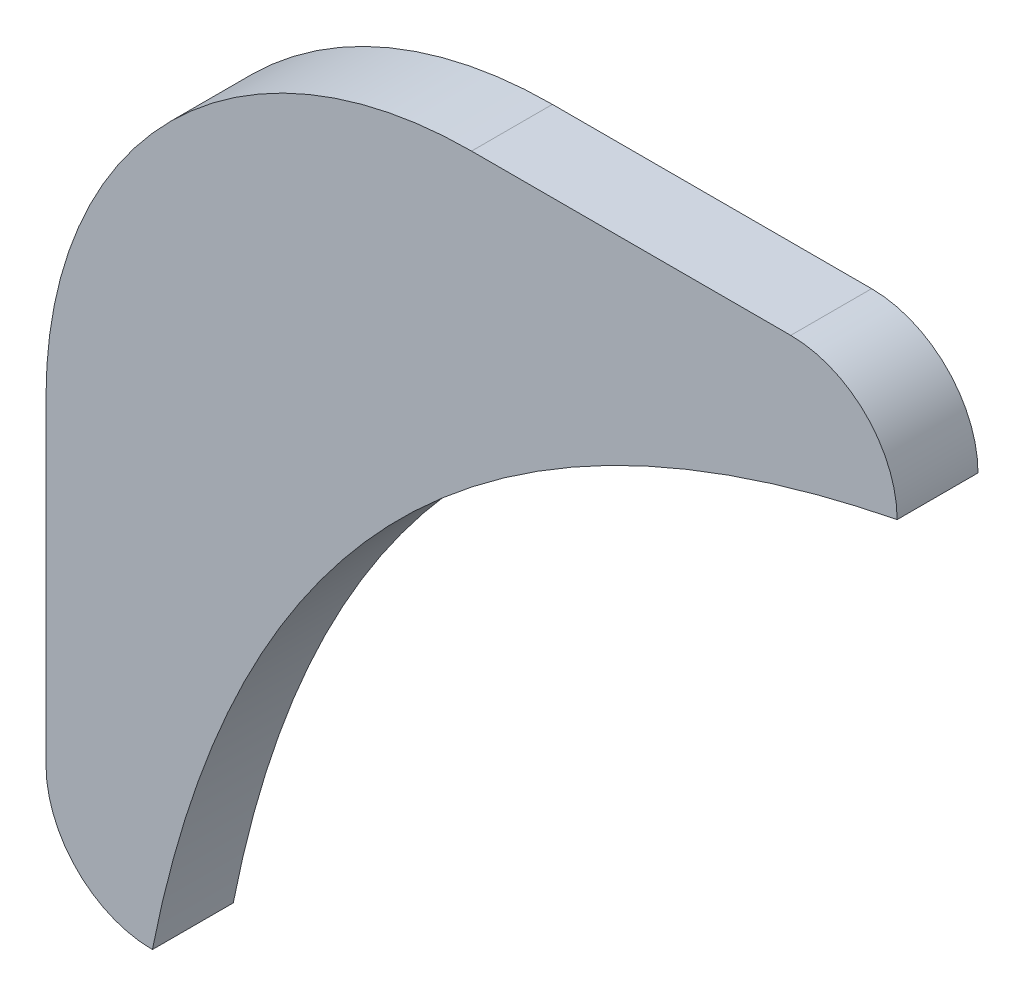
ISO-10303-21;
HEADER;
FILE_DESCRIPTION(('STEP AP214'),'2;1');
FILE_NAME('part.step','',(''),(''),'','','');
FILE_SCHEMA(('AUTOMOTIVE_DESIGN { 1 0 10303 214 1 1 1 1 }'));
ENDSEC;
DATA;
#1=APPLICATION_CONTEXT('core data for automotive mechanical design processes');
#2=APPLICATION_PROTOCOL_DEFINITION('international standard','automotive_design',2000,#1);
#3=PRODUCT_CONTEXT('',#1,'mechanical');
#4=PRODUCT('Part','Part','',(#3));
#5=PRODUCT_RELATED_PRODUCT_CATEGORY('part','',(#4));
#6=PRODUCT_DEFINITION_FORMATION('','',#4);
#7=PRODUCT_DEFINITION_CONTEXT('part definition',#1,'design');
#8=PRODUCT_DEFINITION('design','',#6,#7);
#9=PRODUCT_DEFINITION_SHAPE('','',#8);
#10=(LENGTH_UNIT() NAMED_UNIT(*) SI_UNIT(.MILLI.,.METRE.));
#11=(NAMED_UNIT(*) PLANE_ANGLE_UNIT() SI_UNIT($,.RADIAN.));
#12=(NAMED_UNIT(*) SI_UNIT($,.STERADIAN.) SOLID_ANGLE_UNIT());
#13=UNCERTAINTY_MEASURE_WITH_UNIT(LENGTH_MEASURE(1.E-05),#10,'distance_accuracy_value','');
#14=(GEOMETRIC_REPRESENTATION_CONTEXT(3) GLOBAL_UNCERTAINTY_ASSIGNED_CONTEXT((#13)) GLOBAL_UNIT_ASSIGNED_CONTEXT((#10,
#11,#12)) REPRESENTATION_CONTEXT('',''));
#15=CARTESIAN_POINT('',(0.,0.,0.));
#16=DIRECTION('',(0.,0.,1.));
#17=DIRECTION('',(1.,0.,0.));
#18=AXIS2_PLACEMENT_3D('',#15,#16,#17);
#19=CARTESIAN_POINT('',(44.45,44.45,4.826));
#20=DIRECTION('',(0.,0.,-1.));
#21=DIRECTION('',(-1.,0.,0.));
#22=AXIS2_PLACEMENT_3D('',#19,#20,#21);
#23=CYLINDRICAL_SURFACE('',#22,6.35);
#24=CARTESIAN_POINT('',(44.45,44.45,0.));
#25=DIRECTION('',(0.,0.,1.));
#26=DIRECTION('',(-1.,0.,0.));
#27=AXIS2_PLACEMENT_3D('',#24,#25,#26);
#28=CIRCLE('',#27,6.35);
#29=CARTESIAN_POINT('',(50.8,44.45,0.));
#30=VERTEX_POINT('',#29);
#31=CARTESIAN_POINT('',(44.4499999999999,50.8,0.));
#32=VERTEX_POINT('',#31);
#33=EDGE_CURVE('E120',#30,#32,#28,.T.);
#34=ORIENTED_EDGE('',*,*,#33,.T.);
#35=DIRECTION('',(0.,0.,-1.));
#36=VECTOR('',#35,1.);
#37=CARTESIAN_POINT('',(44.4499999999999,50.8,4.826));
#38=LINE('',#37,#36);
#39=CARTESIAN_POINT('',(44.4499999999999,50.8,4.826));
#40=VERTEX_POINT('',#39);
#41=EDGE_CURVE('E11',#40,#32,#38,.T.);
#42=ORIENTED_EDGE('',*,*,#41,.F.);
#43=CARTESIAN_POINT('',(44.45,44.45,4.826));
#44=DIRECTION('',(0.,0.,1.));
#45=DIRECTION('',(-1.,0.,0.));
#46=AXIS2_PLACEMENT_3D('',#43,#44,#45);
#47=CIRCLE('',#46,6.35);
#48=CARTESIAN_POINT('',(50.8,44.45,4.826));
#49=VERTEX_POINT('',#48);
#50=EDGE_CURVE('E160',#49,#40,#47,.T.);
#51=ORIENTED_EDGE('',*,*,#50,.F.);
#52=DIRECTION('',(0.,0.,-1.));
#53=VECTOR('',#52,1.);
#54=CARTESIAN_POINT('',(50.8,44.45,4.826));
#55=LINE('',#54,#53);
#56=EDGE_CURVE('E113',#49,#30,#55,.T.);
#57=ORIENTED_EDGE('',*,*,#56,.T.);
#58=EDGE_LOOP('',(#34,#42,#51,#57));
#59=FACE_BOUND('',#58,.T.);
#60=ADVANCED_FACE('F33',(#59),#23,.T.);
#61=CARTESIAN_POINT('',(25.4000000000002,50.8,4.826));
#62=DIRECTION('',(0.,-1.,0.));
#63=DIRECTION('',(0.,0.,-1.));
#64=AXIS2_PLACEMENT_3D('',#61,#62,#63);
#65=PLANE('',#64);
#66=DIRECTION('',(-1.,0.,0.));
#67=VECTOR('',#66,1.);
#68=CARTESIAN_POINT('',(25.4000000000002,50.8,0.));
#69=LINE('',#68,#67);
#70=CARTESIAN_POINT('',(25.4000000000002,50.8,0.));
#71=VERTEX_POINT('',#70);
#72=EDGE_CURVE('E145',#32,#71,#69,.T.);
#73=ORIENTED_EDGE('',*,*,#72,.T.);
#74=DIRECTION('',(0.,0.,-1.));
#75=VECTOR('',#74,1.);
#76=CARTESIAN_POINT('',(25.4000000000002,50.8,4.826));
#77=LINE('',#76,#75);
#78=CARTESIAN_POINT('',(25.4000000000002,50.8,4.826));
#79=VERTEX_POINT('',#78);
#80=EDGE_CURVE('E41',#79,#71,#77,.T.);
#81=ORIENTED_EDGE('',*,*,#80,.F.);
#82=DIRECTION('',(-1.,0.,0.));
#83=VECTOR('',#82,1.);
#84=CARTESIAN_POINT('',(25.4000000000002,50.8,4.826));
#85=LINE('',#84,#83);
#86=EDGE_CURVE('E86',#40,#79,#85,.T.);
#87=ORIENTED_EDGE('',*,*,#86,.F.);
#88=ORIENTED_EDGE('',*,*,#41,.T.);
#89=EDGE_LOOP('',(#73,#81,#87,#88));
#90=FACE_BOUND('',#89,.T.);
#91=ADVANCED_FACE('F138',(#90),#65,.F.);
#92=CARTESIAN_POINT('',(25.4,25.4,4.826));
#93=DIRECTION('',(0.,0.,-1.));
#94=DIRECTION('',(-1.,0.,0.));
#95=AXIS2_PLACEMENT_3D('',#92,#93,#94);
#96=CYLINDRICAL_SURFACE('',#95,25.4);
#97=CARTESIAN_POINT('',(25.4,25.4,0.));
#98=DIRECTION('',(0.,0.,1.));
#99=DIRECTION('',(-1.,0.,0.));
#100=AXIS2_PLACEMENT_3D('',#97,#98,#99);
#101=CIRCLE('',#100,25.4);
#102=CARTESIAN_POINT('',(0.,25.3999999999998,0.));
#103=VERTEX_POINT('',#102);
#104=EDGE_CURVE('E152',#71,#103,#101,.T.);
#105=ORIENTED_EDGE('',*,*,#104,.T.);
#106=DIRECTION('',(0.,0.,-1.));
#107=VECTOR('',#106,1.);
#108=CARTESIAN_POINT('',(0.,25.3999999999998,4.826));
#109=LINE('',#108,#107);
#110=CARTESIAN_POINT('',(0.,25.3999999999998,4.826));
#111=VERTEX_POINT('',#110);
#112=EDGE_CURVE('E108',#111,#103,#109,.T.);
#113=ORIENTED_EDGE('',*,*,#112,.F.);
#114=CARTESIAN_POINT('',(25.4,25.4,4.826));
#115=DIRECTION('',(0.,0.,1.));
#116=DIRECTION('',(-1.,0.,0.));
#117=AXIS2_PLACEMENT_3D('',#114,#115,#116);
#118=CIRCLE('',#117,25.4);
#119=EDGE_CURVE('E99',#79,#111,#118,.T.);
#120=ORIENTED_EDGE('',*,*,#119,.F.);
#121=ORIENTED_EDGE('',*,*,#80,.T.);
#122=EDGE_LOOP('',(#105,#113,#120,#121));
#123=FACE_BOUND('',#122,.T.);
#124=ADVANCED_FACE('F136',(#123),#96,.T.);
#125=CARTESIAN_POINT('',(0.,6.35000000000004,4.826));
#126=DIRECTION('',(1.,0.,0.));
#127=DIRECTION('',(0.,0.,-1.));
#128=AXIS2_PLACEMENT_3D('',#125,#126,#127);
#129=PLANE('',#128);
#130=DIRECTION('',(0.,-1.,0.));
#131=VECTOR('',#130,1.);
#132=CARTESIAN_POINT('',(0.,6.35000000000004,0.));
#133=LINE('',#132,#131);
#134=CARTESIAN_POINT('',(0.,6.35000000000004,0.));
#135=VERTEX_POINT('',#134);
#136=EDGE_CURVE('E107',#103,#135,#133,.T.);
#137=ORIENTED_EDGE('',*,*,#136,.T.);
#138=DIRECTION('',(0.,0.,-1.));
#139=VECTOR('',#138,1.);
#140=CARTESIAN_POINT('',(0.,6.35000000000004,4.826));
#141=LINE('',#140,#139);
#142=CARTESIAN_POINT('',(0.,6.35000000000004,4.826));
#143=VERTEX_POINT('',#142);
#144=EDGE_CURVE('E104',#143,#135,#141,.T.);
#145=ORIENTED_EDGE('',*,*,#144,.F.);
#146=DIRECTION('',(0.,-1.,0.));
#147=VECTOR('',#146,1.);
#148=CARTESIAN_POINT('',(0.,6.35000000000004,4.826));
#149=LINE('',#148,#147);
#150=EDGE_CURVE('E93',#111,#143,#149,.T.);
#151=ORIENTED_EDGE('',*,*,#150,.F.);
#152=ORIENTED_EDGE('',*,*,#112,.T.);
#153=EDGE_LOOP('',(#137,#145,#151,#152));
#154=FACE_BOUND('',#153,.T.);
#155=ADVANCED_FACE('F105',(#154),#129,.F.);
#156=CARTESIAN_POINT('',(6.35,6.35,4.826));
#157=DIRECTION('',(0.,0.,-1.));
#158=DIRECTION('',(-1.,0.,0.));
#159=AXIS2_PLACEMENT_3D('',#156,#157,#158);
#160=CYLINDRICAL_SURFACE('',#159,6.35);
#161=CARTESIAN_POINT('',(6.35,6.35,0.));
#162=DIRECTION('',(0.,0.,1.));
#163=DIRECTION('',(1.,0.,0.));
#164=AXIS2_PLACEMENT_3D('',#161,#162,#163);
#165=CIRCLE('',#164,6.35);
#166=CARTESIAN_POINT('',(6.35000000000004,0.,0.));
#167=VERTEX_POINT('',#166);
#168=EDGE_CURVE('E72',#135,#167,#165,.T.);
#169=ORIENTED_EDGE('',*,*,#168,.T.);
#170=DIRECTION('',(0.,0.,-1.));
#171=VECTOR('',#170,1.);
#172=CARTESIAN_POINT('',(6.35000000000004,0.,4.826));
#173=LINE('',#172,#171);
#174=CARTESIAN_POINT('',(6.35000000000004,0.,4.826));
#175=VERTEX_POINT('',#174);
#176=EDGE_CURVE('E109',#175,#167,#173,.T.);
#177=ORIENTED_EDGE('',*,*,#176,.F.);
#178=CARTESIAN_POINT('',(6.35,6.35,4.826));
#179=DIRECTION('',(0.,0.,1.));
#180=DIRECTION('',(1.,0.,0.));
#181=AXIS2_PLACEMENT_3D('',#178,#179,#180);
#182=CIRCLE('',#181,6.35);
#183=EDGE_CURVE('E97',#143,#175,#182,.T.);
#184=ORIENTED_EDGE('',*,*,#183,.F.);
#185=ORIENTED_EDGE('',*,*,#144,.T.);
#186=EDGE_LOOP('',(#169,#177,#184,#185));
#187=FACE_BOUND('',#186,.T.);
#188=ADVANCED_FACE('F111',(#187),#160,.T.);
#189=CARTESIAN_POINT('',(6.35000000000004,0.,4.826));
#190=CARTESIAN_POINT('',(13.6868944275857,37.0821774920595,4.826));
#191=CARTESIAN_POINT('',(50.8,44.45,4.826));
#192=B_SPLINE_CURVE_WITH_KNOTS('',2,(#189,#190,#191),.UNSPECIFIED.,.F.,.F.,(3,3),(0.,1.),.UNSPECIFIED.);
#193=DIRECTION('',(0.,0.,-1.));
#194=VECTOR('',#193,1.);
#195=SURFACE_OF_LINEAR_EXTRUSION('',#192,#194);
#196=CARTESIAN_POINT('',(6.35000000000004,0.,0.));
#197=CARTESIAN_POINT('',(13.6868944275857,37.0821774920595,0.));
#198=CARTESIAN_POINT('',(50.8,44.45,0.));
#199=B_SPLINE_CURVE_WITH_KNOTS('',2,(#196,#197,#198),.UNSPECIFIED.,.F.,.F.,(3,3),(0.,1.),.UNSPECIFIED.);
#200=EDGE_CURVE('E78',#167,#30,#199,.T.);
#201=ORIENTED_EDGE('',*,*,#200,.T.);
#202=ORIENTED_EDGE('',*,*,#56,.F.);
#203=EDGE_CURVE('E49',#175,#49,#192,.T.);
#204=ORIENTED_EDGE('',*,*,#203,.F.);
#205=ORIENTED_EDGE('',*,*,#176,.T.);
#206=EDGE_LOOP('',(#201,#202,#204,#205));
#207=FACE_BOUND('',#206,.T.);
#208=ADVANCED_FACE('F126',(#207),#195,.F.);
#209=CARTESIAN_POINT('',(44.45,44.45,4.826));
#210=DIRECTION('',(0.,0.,-1.));
#211=DIRECTION('',(-1.,0.,0.));
#212=AXIS2_PLACEMENT_3D('',#209,#210,#211);
#213=PLANE('',#212);
#214=ORIENTED_EDGE('',*,*,#50,.T.);
#215=ORIENTED_EDGE('',*,*,#86,.T.);
#216=ORIENTED_EDGE('',*,*,#119,.T.);
#217=ORIENTED_EDGE('',*,*,#150,.T.);
#218=ORIENTED_EDGE('',*,*,#183,.T.);
#219=ORIENTED_EDGE('',*,*,#203,.T.);
#220=EDGE_LOOP('',(#214,#215,#216,#217,#218,#219));
#221=FACE_BOUND('',#220,.T.);
#222=ADVANCED_FACE('F95',(#221),#213,.F.);
#223=CARTESIAN_POINT('',(44.45,44.45,0.));
#224=DIRECTION('',(0.,0.,-1.));
#225=DIRECTION('',(-1.,0.,0.));
#226=AXIS2_PLACEMENT_3D('',#223,#224,#225);
#227=PLANE('',#226);
#228=ORIENTED_EDGE('',*,*,#33,.F.);
#229=ORIENTED_EDGE('',*,*,#200,.F.);
#230=ORIENTED_EDGE('',*,*,#168,.F.);
#231=ORIENTED_EDGE('',*,*,#136,.F.);
#232=ORIENTED_EDGE('',*,*,#104,.F.);
#233=ORIENTED_EDGE('',*,*,#72,.F.);
#234=EDGE_LOOP('',(#228,#229,#230,#231,#232,#233));
#235=FACE_BOUND('',#234,.T.);
#236=ADVANCED_FACE('F130',(#235),#227,.T.);
#237=CLOSED_SHELL('',(#60,#91,#124,#155,#188,#208,#222,#236));
#238=MANIFOLD_SOLID_BREP('B2',#237);
#239=ADVANCED_BREP_SHAPE_REPRESENTATION('',(#18,#238),#14);
#240=SHAPE_DEFINITION_REPRESENTATION(#9,#239);
ENDSEC;
END-ISO-10303-21;
